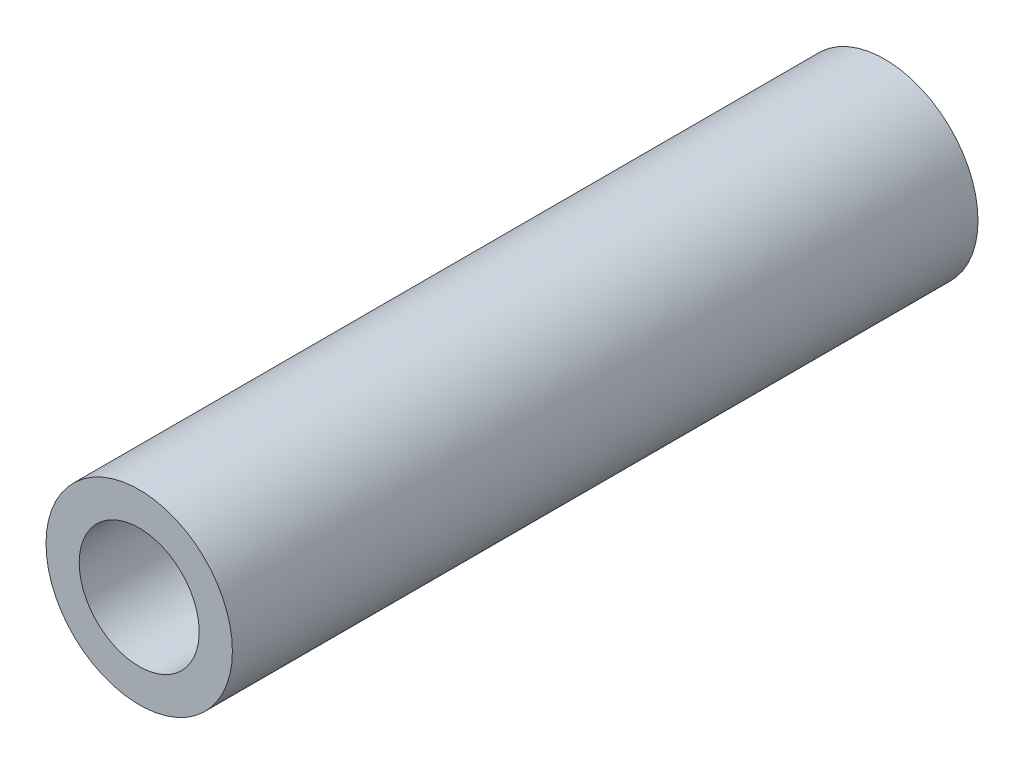
ISO-10303-21;
HEADER;
FILE_DESCRIPTION(('STEP AP214'),'2;1');
FILE_NAME('part.step','',(''),(''),'','','');
FILE_SCHEMA(('AUTOMOTIVE_DESIGN { 1 0 10303 214 1 1 1 1 }'));
ENDSEC;
DATA;
#1=APPLICATION_CONTEXT('core data for automotive mechanical design processes');
#2=APPLICATION_PROTOCOL_DEFINITION('international standard','automotive_design',2000,#1);
#3=PRODUCT_CONTEXT('',#1,'mechanical');
#4=PRODUCT('Part','Part','',(#3));
#5=PRODUCT_RELATED_PRODUCT_CATEGORY('part','',(#4));
#6=PRODUCT_DEFINITION_FORMATION('','',#4);
#7=PRODUCT_DEFINITION_CONTEXT('part definition',#1,'design');
#8=PRODUCT_DEFINITION('design','',#6,#7);
#9=PRODUCT_DEFINITION_SHAPE('','',#8);
#10=(LENGTH_UNIT() NAMED_UNIT(*) SI_UNIT(.MILLI.,.METRE.));
#11=(NAMED_UNIT(*) PLANE_ANGLE_UNIT() SI_UNIT($,.RADIAN.));
#12=(NAMED_UNIT(*) SI_UNIT($,.STERADIAN.) SOLID_ANGLE_UNIT());
#13=UNCERTAINTY_MEASURE_WITH_UNIT(LENGTH_MEASURE(1.E-05),#10,'distance_accuracy_value','');
#14=(GEOMETRIC_REPRESENTATION_CONTEXT(3) GLOBAL_UNCERTAINTY_ASSIGNED_CONTEXT((#13)) GLOBAL_UNIT_ASSIGNED_CONTEXT((#10,
#11,#12)) REPRESENTATION_CONTEXT('',''));
#15=CARTESIAN_POINT('',(0.,0.,0.));
#16=DIRECTION('',(0.,0.,1.));
#17=DIRECTION('',(1.,0.,0.));
#18=AXIS2_PLACEMENT_3D('',#15,#16,#17);
#19=CARTESIAN_POINT('',(0.,0.,31.75));
#20=DIRECTION('',(0.,0.,0.999999999999999));
#21=DIRECTION('',(1.,0.,0.));
#22=AXIS2_PLACEMENT_3D('',#19,#20,#21);
#23=PLANE('',#22);
#24=CARTESIAN_POINT('',(0.,0.,31.75));
#25=DIRECTION('',(0.,0.,0.999999999999999));
#26=DIRECTION('',(1.,0.,0.));
#27=AXIS2_PLACEMENT_3D('',#24,#25,#26);
#28=CIRCLE('',#27,3.96875);
#29=CARTESIAN_POINT('',(-3.96875,0.,31.75));
#30=VERTEX_POINT('',#29);
#31=EDGE_CURVE('E10',#30,#30,#28,.T.);
#32=ORIENTED_EDGE('',*,*,#31,.T.);
#33=EDGE_LOOP('',(#32));
#34=FACE_BOUND('',#33,.T.);
#35=CARTESIAN_POINT('',(0.,0.,31.75));
#36=DIRECTION('',(0.,0.,0.999999999999999));
#37=DIRECTION('',(1.,0.,0.));
#38=AXIS2_PLACEMENT_3D('',#35,#36,#37);
#39=CIRCLE('',#38,2.555);
#40=CARTESIAN_POINT('',(-2.555,0.,31.75));
#41=VERTEX_POINT('',#40);
#42=EDGE_CURVE('E50',#41,#41,#39,.T.);
#43=ORIENTED_EDGE('',*,*,#42,.F.);
#44=EDGE_LOOP('',(#43));
#45=FACE_BOUND('',#44,.T.);
#46=ADVANCED_FACE('F39',(#34,#45),#23,.T.);
#47=CARTESIAN_POINT('',(0.,0.,0.));
#48=DIRECTION('',(0.,0.,0.999999999999999));
#49=DIRECTION('',(1.,0.,0.));
#50=AXIS2_PLACEMENT_3D('',#47,#48,#49);
#51=PLANE('',#50);
#52=CARTESIAN_POINT('',(0.,0.,0.));
#53=DIRECTION('',(0.,0.,0.999999999999999));
#54=DIRECTION('',(1.,0.,0.));
#55=AXIS2_PLACEMENT_3D('',#52,#53,#54);
#56=CIRCLE('',#55,3.96875);
#57=CARTESIAN_POINT('',(-3.96875,0.,0.));
#58=VERTEX_POINT('',#57);
#59=EDGE_CURVE('E43',#58,#58,#56,.T.);
#60=ORIENTED_EDGE('',*,*,#59,.F.);
#61=EDGE_LOOP('',(#60));
#62=FACE_BOUND('',#61,.T.);
#63=CARTESIAN_POINT('',(0.,0.,0.));
#64=DIRECTION('',(0.,0.,0.999999999999999));
#65=DIRECTION('',(1.,0.,0.));
#66=AXIS2_PLACEMENT_3D('',#63,#64,#65);
#67=CIRCLE('',#66,2.555);
#68=CARTESIAN_POINT('',(-2.555,0.,0.));
#69=VERTEX_POINT('',#68);
#70=EDGE_CURVE('E52',#69,#69,#67,.T.);
#71=ORIENTED_EDGE('',*,*,#70,.T.);
#72=EDGE_LOOP('',(#71));
#73=FACE_BOUND('',#72,.T.);
#74=ADVANCED_FACE('F62',(#62,#73),#51,.F.);
#75=CARTESIAN_POINT('',(0.,0.,31.75));
#76=DIRECTION('',(0.,0.,-0.999999999999999));
#77=DIRECTION('',(-1.,0.,0.));
#78=AXIS2_PLACEMENT_3D('',#75,#76,#77);
#79=CYLINDRICAL_SURFACE('',#78,3.96875);
#80=CARTESIAN_POINT('',(-3.96875,0.,31.75));
#81=CARTESIAN_POINT('',(-3.96875,0.,31.4192708333333));
#82=CARTESIAN_POINT('',(-3.96875,0.,31.0885416666666));
#83=CARTESIAN_POINT('',(-3.96875,0.,30.4270833333333));
#84=CARTESIAN_POINT('',(-3.96875,0.,30.0963541666666));
#85=CARTESIAN_POINT('',(-3.96875,0.,29.4348958333333));
#86=CARTESIAN_POINT('',(-3.96875,0.,29.1041666666666));
#87=CARTESIAN_POINT('',(-3.96875,0.,28.4427083333333));
#88=CARTESIAN_POINT('',(-3.96875,0.,28.1119791666666));
#89=CARTESIAN_POINT('',(-3.96875,0.,27.4505208333333));
#90=CARTESIAN_POINT('',(-3.96875,0.,27.1197916666666));
#91=CARTESIAN_POINT('',(-3.96875,0.,26.4583333333333));
#92=CARTESIAN_POINT('',(-3.96875,0.,26.1276041666666));
#93=CARTESIAN_POINT('',(-3.96875,0.,25.4661458333333));
#94=CARTESIAN_POINT('',(-3.96875,0.,25.1354166666666));
#95=CARTESIAN_POINT('',(-3.96875,0.,24.4739583333333));
#96=CARTESIAN_POINT('',(-3.96875,0.,24.1432291666666));
#97=CARTESIAN_POINT('',(-3.96875,0.,23.4817708333333));
#98=CARTESIAN_POINT('',(-3.96875,0.,23.1510416666666));
#99=CARTESIAN_POINT('',(-3.96875,0.,22.4895833333333));
#100=CARTESIAN_POINT('',(-3.96875,0.,22.1588541666666));
#101=CARTESIAN_POINT('',(-3.96875,0.,21.4973958333333));
#102=CARTESIAN_POINT('',(-3.96875,0.,21.1666666666666));
#103=CARTESIAN_POINT('',(-3.96875,0.,20.5052083333333));
#104=CARTESIAN_POINT('',(-3.96875,0.,20.1744791666666));
#105=CARTESIAN_POINT('',(-3.96875,0.,19.5130208333333));
#106=CARTESIAN_POINT('',(-3.96875,0.,19.1822916666666));
#107=CARTESIAN_POINT('',(-3.96875,0.,18.5208333333333));
#108=CARTESIAN_POINT('',(-3.96875,0.,18.1901041666666));
#109=CARTESIAN_POINT('',(-3.96875,0.,17.5286458333333));
#110=CARTESIAN_POINT('',(-3.96875,0.,17.1979166666666));
#111=CARTESIAN_POINT('',(-3.96875,0.,16.5364583333333));
#112=CARTESIAN_POINT('',(-3.96875,0.,16.2057291666666));
#113=CARTESIAN_POINT('',(-3.96875,0.,15.5442708333333));
#114=CARTESIAN_POINT('',(-3.96875,0.,15.2135416666666));
#115=CARTESIAN_POINT('',(-3.96875,0.,14.5520833333333));
#116=CARTESIAN_POINT('',(-3.96875,0.,14.2213541666666));
#117=CARTESIAN_POINT('',(-3.96875,0.,13.5598958333333));
#118=CARTESIAN_POINT('',(-3.96875,0.,13.2291666666666));
#119=CARTESIAN_POINT('',(-3.96875,0.,12.5677083333333));
#120=CARTESIAN_POINT('',(-3.96875,0.,12.2369791666666));
#121=CARTESIAN_POINT('',(-3.96875,0.,11.5755208333333));
#122=CARTESIAN_POINT('',(-3.96875,0.,11.2447916666666));
#123=CARTESIAN_POINT('',(-3.96875,0.,10.5833333333333));
#124=CARTESIAN_POINT('',(-3.96875,0.,10.2526041666666));
#125=CARTESIAN_POINT('',(-3.96875,0.,9.59114583333331));
#126=CARTESIAN_POINT('',(-3.96875,0.,9.26041666666664));
#127=CARTESIAN_POINT('',(-3.96875,0.,8.59895833333331));
#128=CARTESIAN_POINT('',(-3.96875,0.,8.26822916666665));
#129=CARTESIAN_POINT('',(-3.96875,0.,7.60677083333332));
#130=CARTESIAN_POINT('',(-3.96875,0.,7.27604166666665));
#131=CARTESIAN_POINT('',(-3.96875,0.,6.61458333333332));
#132=CARTESIAN_POINT('',(-3.96875,0.,6.28385416666665));
#133=CARTESIAN_POINT('',(-3.96875,0.,5.62239583333332));
#134=CARTESIAN_POINT('',(-3.96875,0.,5.29166666666665));
#135=CARTESIAN_POINT('',(-3.96875,0.,4.63020833333332));
#136=CARTESIAN_POINT('',(-3.96875,0.,4.29947916666665));
#137=CARTESIAN_POINT('',(-3.96875,0.,3.63802083333332));
#138=CARTESIAN_POINT('',(-3.96875,0.,3.30729166666665));
#139=CARTESIAN_POINT('',(-3.96875,0.,2.64583333333332));
#140=CARTESIAN_POINT('',(-3.96875,0.,2.31510416666666));
#141=CARTESIAN_POINT('',(-3.96875,0.,1.65364583333332));
#142=CARTESIAN_POINT('',(-3.96875,0.,1.32291666666665));
#143=CARTESIAN_POINT('',(-3.96875,0.,0.661458333333323));
#144=CARTESIAN_POINT('',(-3.96875,0.,0.330729166666658));
#145=CARTESIAN_POINT('',(-3.96875,0.,0.));
#146=B_SPLINE_CURVE_WITH_KNOTS('',3,(#80,#81,#82,#83,#84,#85,#86,#87,#88,#89,#90,#91,#92,#93,
#94,#95,#96,#97,#98,#99,#100,#101,#102,#103,#104,#105,#106,#107,#108,#109,#110,#111,#112,#113,
#114,#115,#116,#117,#118,#119,#120,#121,#122,#123,#124,#125,#126,#127,#128,#129,#130,#131,#132,
#133,#134,#135,#136,#137,#138,#139,#140,#141,#142,#143,#144,#145),.UNSPECIFIED.,.F.,.F.,(4,2,2,
2,2,2,2,2,2,2,2,2,2,2,2,2,2,2,2,2,2,2,2,2,2,2,2,2,2,2,2,2,4),(0.,0.992187500000002,1.984375,
2.9765625,3.96875,4.9609375,5.953125,6.94531249999999,7.93749999999999,8.92968749999999,
9.92187499999999,10.9140625,11.90625,12.8984375,13.890625,14.8828125,15.875,16.8671875,
17.859375,18.8515625,19.84375,20.8359375,21.828125,22.8203125,23.8125,24.8046875,25.796875,
26.7890625,27.78125,28.7734375,29.765625,30.7578125,31.75),.UNSPECIFIED.);
#147=EDGE_CURVE('BSEAM41',#30,#58,#146,.T.);
#148=ORIENTED_EDGE('',*,*,#31,.F.);
#149=ORIENTED_EDGE('',*,*,#59,.T.);
#150=ORIENTED_EDGE('',*,*,#147,.T.);
#151=ORIENTED_EDGE('',*,*,#147,.F.);
#152=EDGE_LOOP('',(#148,#150,#149,#151));
#153=FACE_BOUND('',#152,.T.);
#154=ADVANCED_FACE('F41',(#153),#79,.T.);
#155=CARTESIAN_POINT('',(0.,0.,31.75));
#156=DIRECTION('',(0.,0.,-0.999999999999999));
#157=DIRECTION('',(-1.,0.,0.));
#158=AXIS2_PLACEMENT_3D('',#155,#156,#157);
#159=CYLINDRICAL_SURFACE('',#158,2.555);
#160=CARTESIAN_POINT('',(-2.555,0.,31.75));
#161=CARTESIAN_POINT('',(-2.555,0.,31.4192708333333));
#162=CARTESIAN_POINT('',(-2.555,0.,31.0885416666666));
#163=CARTESIAN_POINT('',(-2.555,0.,30.4270833333333));
#164=CARTESIAN_POINT('',(-2.555,0.,30.0963541666666));
#165=CARTESIAN_POINT('',(-2.555,0.,29.4348958333333));
#166=CARTESIAN_POINT('',(-2.555,0.,29.1041666666666));
#167=CARTESIAN_POINT('',(-2.555,0.,28.4427083333333));
#168=CARTESIAN_POINT('',(-2.555,0.,28.1119791666666));
#169=CARTESIAN_POINT('',(-2.555,0.,27.4505208333333));
#170=CARTESIAN_POINT('',(-2.555,0.,27.1197916666666));
#171=CARTESIAN_POINT('',(-2.555,0.,26.4583333333333));
#172=CARTESIAN_POINT('',(-2.555,0.,26.1276041666666));
#173=CARTESIAN_POINT('',(-2.555,0.,25.4661458333333));
#174=CARTESIAN_POINT('',(-2.555,0.,25.1354166666666));
#175=CARTESIAN_POINT('',(-2.555,0.,24.4739583333333));
#176=CARTESIAN_POINT('',(-2.555,0.,24.1432291666666));
#177=CARTESIAN_POINT('',(-2.555,0.,23.4817708333333));
#178=CARTESIAN_POINT('',(-2.555,0.,23.1510416666666));
#179=CARTESIAN_POINT('',(-2.555,0.,22.4895833333333));
#180=CARTESIAN_POINT('',(-2.555,0.,22.1588541666666));
#181=CARTESIAN_POINT('',(-2.555,0.,21.4973958333333));
#182=CARTESIAN_POINT('',(-2.555,0.,21.1666666666666));
#183=CARTESIAN_POINT('',(-2.555,0.,20.5052083333333));
#184=CARTESIAN_POINT('',(-2.555,0.,20.1744791666666));
#185=CARTESIAN_POINT('',(-2.555,0.,19.5130208333333));
#186=CARTESIAN_POINT('',(-2.555,0.,19.1822916666666));
#187=CARTESIAN_POINT('',(-2.555,0.,18.5208333333333));
#188=CARTESIAN_POINT('',(-2.555,0.,18.1901041666666));
#189=CARTESIAN_POINT('',(-2.555,0.,17.5286458333333));
#190=CARTESIAN_POINT('',(-2.555,0.,17.1979166666666));
#191=CARTESIAN_POINT('',(-2.555,0.,16.5364583333333));
#192=CARTESIAN_POINT('',(-2.555,0.,16.2057291666666));
#193=CARTESIAN_POINT('',(-2.555,0.,15.5442708333333));
#194=CARTESIAN_POINT('',(-2.555,0.,15.2135416666666));
#195=CARTESIAN_POINT('',(-2.555,0.,14.5520833333333));
#196=CARTESIAN_POINT('',(-2.555,0.,14.2213541666666));
#197=CARTESIAN_POINT('',(-2.555,0.,13.5598958333333));
#198=CARTESIAN_POINT('',(-2.555,0.,13.2291666666666));
#199=CARTESIAN_POINT('',(-2.555,0.,12.5677083333333));
#200=CARTESIAN_POINT('',(-2.555,0.,12.2369791666666));
#201=CARTESIAN_POINT('',(-2.555,0.,11.5755208333333));
#202=CARTESIAN_POINT('',(-2.555,0.,11.2447916666666));
#203=CARTESIAN_POINT('',(-2.555,0.,10.5833333333333));
#204=CARTESIAN_POINT('',(-2.555,0.,10.2526041666666));
#205=CARTESIAN_POINT('',(-2.555,0.,9.59114583333331));
#206=CARTESIAN_POINT('',(-2.555,0.,9.26041666666664));
#207=CARTESIAN_POINT('',(-2.555,0.,8.59895833333331));
#208=CARTESIAN_POINT('',(-2.555,0.,8.26822916666665));
#209=CARTESIAN_POINT('',(-2.555,0.,7.60677083333332));
#210=CARTESIAN_POINT('',(-2.555,0.,7.27604166666665));
#211=CARTESIAN_POINT('',(-2.555,0.,6.61458333333332));
#212=CARTESIAN_POINT('',(-2.555,0.,6.28385416666665));
#213=CARTESIAN_POINT('',(-2.555,0.,5.62239583333332));
#214=CARTESIAN_POINT('',(-2.555,0.,5.29166666666665));
#215=CARTESIAN_POINT('',(-2.555,0.,4.63020833333332));
#216=CARTESIAN_POINT('',(-2.555,0.,4.29947916666665));
#217=CARTESIAN_POINT('',(-2.555,0.,3.63802083333332));
#218=CARTESIAN_POINT('',(-2.555,0.,3.30729166666665));
#219=CARTESIAN_POINT('',(-2.555,0.,2.64583333333332));
#220=CARTESIAN_POINT('',(-2.555,0.,2.31510416666666));
#221=CARTESIAN_POINT('',(-2.555,0.,1.65364583333332));
#222=CARTESIAN_POINT('',(-2.555,0.,1.32291666666665));
#223=CARTESIAN_POINT('',(-2.555,0.,0.661458333333323));
#224=CARTESIAN_POINT('',(-2.555,0.,0.330729166666658));
#225=CARTESIAN_POINT('',(-2.555,0.,0.));
#226=B_SPLINE_CURVE_WITH_KNOTS('',3,(#160,#161,#162,#163,#164,#165,#166,#167,#168,#169,#170,
#171,#172,#173,#174,#175,#176,#177,#178,#179,#180,#181,#182,#183,#184,#185,#186,#187,#188,#189,
#190,#191,#192,#193,#194,#195,#196,#197,#198,#199,#200,#201,#202,#203,#204,#205,#206,#207,#208,
#209,#210,#211,#212,#213,#214,#215,#216,#217,#218,#219,#220,#221,#222,#223,#224,#225),
.UNSPECIFIED.,.F.,.F.,(4,2,2,2,2,2,2,2,2,2,2,2,2,2,2,2,2,2,2,2,2,2,2,2,2,2,2,2,2,2,2,2,4),(0.,
0.992187500000002,1.984375,2.9765625,3.96875,4.9609375,5.953125,6.94531249999999,
7.93749999999999,8.92968749999999,9.92187499999999,10.9140625,11.90625,12.8984375,13.890625,
14.8828125,15.875,16.8671875,17.859375,18.8515625,19.84375,20.8359375,21.828125,22.8203125,
23.8125,24.8046875,25.796875,26.7890625,27.78125,28.7734375,29.765625,30.7578125,31.75),.UNSPECIFIED.);
#227=EDGE_CURVE('BSEAM58',#41,#69,#226,.T.);
#228=ORIENTED_EDGE('',*,*,#42,.T.);
#229=ORIENTED_EDGE('',*,*,#70,.F.);
#230=ORIENTED_EDGE('',*,*,#227,.T.);
#231=ORIENTED_EDGE('',*,*,#227,.F.);
#232=EDGE_LOOP('',(#228,#230,#229,#231));
#233=FACE_BOUND('',#232,.T.);
#234=ADVANCED_FACE('F58',(#233),#159,.F.);
#235=CLOSED_SHELL('',(#46,#74,#154,#234));
#236=MANIFOLD_SOLID_BREP('B2',#235);
#237=ADVANCED_BREP_SHAPE_REPRESENTATION('',(#18,#236),#14);
#238=SHAPE_DEFINITION_REPRESENTATION(#9,#237);
ENDSEC;
END-ISO-10303-21;
